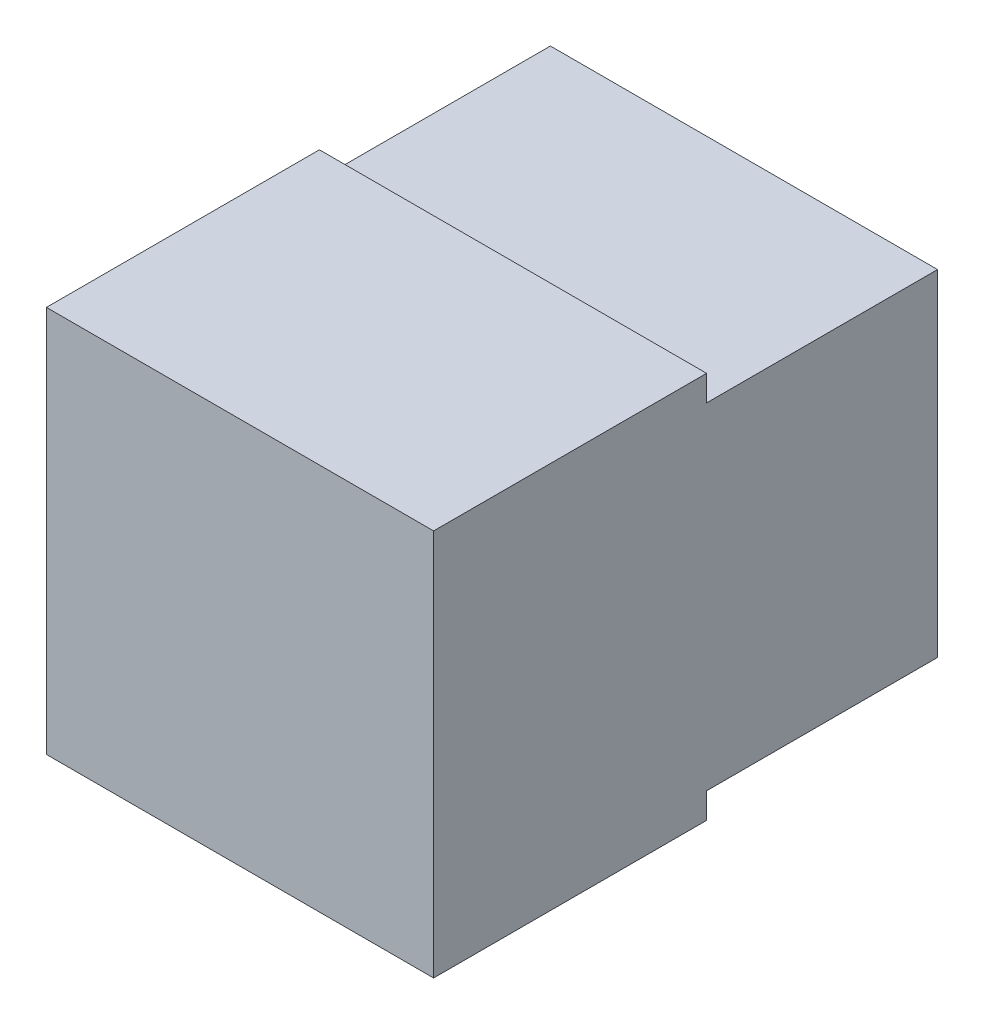
ISO-10303-21;
HEADER;
FILE_DESCRIPTION(('STEP AP214'),'2;1');
FILE_NAME('part.step','',(''),(''),'','','');
FILE_SCHEMA(('AUTOMOTIVE_DESIGN { 1 0 10303 214 1 1 1 1 }'));
ENDSEC;
DATA;
#1=APPLICATION_CONTEXT('core data for automotive mechanical design processes');
#2=APPLICATION_PROTOCOL_DEFINITION('international standard','automotive_design',2000,#1);
#3=PRODUCT_CONTEXT('',#1,'mechanical');
#4=PRODUCT('Part','Part','',(#3));
#5=PRODUCT_RELATED_PRODUCT_CATEGORY('part','',(#4));
#6=PRODUCT_DEFINITION_FORMATION('','',#4);
#7=PRODUCT_DEFINITION_CONTEXT('part definition',#1,'design');
#8=PRODUCT_DEFINITION('design','',#6,#7);
#9=PRODUCT_DEFINITION_SHAPE('','',#8);
#10=(LENGTH_UNIT() NAMED_UNIT(*) SI_UNIT(.MILLI.,.METRE.));
#11=(NAMED_UNIT(*) PLANE_ANGLE_UNIT() SI_UNIT($,.RADIAN.));
#12=(NAMED_UNIT(*) SI_UNIT($,.STERADIAN.) SOLID_ANGLE_UNIT());
#13=UNCERTAINTY_MEASURE_WITH_UNIT(LENGTH_MEASURE(1.E-05),#10,'distance_accuracy_value','');
#14=(GEOMETRIC_REPRESENTATION_CONTEXT(3) GLOBAL_UNCERTAINTY_ASSIGNED_CONTEXT((#13)) GLOBAL_UNIT_ASSIGNED_CONTEXT((#10,
#11,#12)) REPRESENTATION_CONTEXT('',''));
#15=CARTESIAN_POINT('',(0.,0.,0.));
#16=DIRECTION('',(0.,0.,1.));
#17=DIRECTION('',(1.,0.,0.));
#18=AXIS2_PLACEMENT_3D('',#15,#16,#17);
#19=CARTESIAN_POINT('',(0.,0.,-32.5));
#20=DIRECTION('',(0.,0.,-1.));
#21=DIRECTION('',(-1.,0.,0.));
#22=AXIS2_PLACEMENT_3D('',#19,#20,#21);
#23=PLANE('',#22);
#24=DIRECTION('',(1.,0.,0.));
#25=VECTOR('',#24,1.);
#26=CARTESIAN_POINT('',(-23.0488611432322,19.9988611432322,-32.5));
#27=LINE('',#26,#25);
#28=CARTESIAN_POINT('',(-23.0488611432322,19.9988611432322,-32.5));
#29=VERTEX_POINT('',#28);
#30=CARTESIAN_POINT('',(23.0488611432322,19.9988611432322,-32.5));
#31=VERTEX_POINT('',#30);
#32=EDGE_CURVE('E121',#29,#31,#27,.T.);
#33=ORIENTED_EDGE('',*,*,#32,.F.);
#34=DIRECTION('',(0.,-1.,0.));
#35=VECTOR('',#34,1.);
#36=CARTESIAN_POINT('',(-23.0488611432322,23.0488611432322,-32.5));
#37=LINE('',#36,#35);
#38=CARTESIAN_POINT('',(-23.0488611432322,23.0488611432322,-32.5));
#39=VERTEX_POINT('',#38);
#40=EDGE_CURVE('E135',#39,#29,#37,.T.);
#41=ORIENTED_EDGE('',*,*,#40,.F.);
#42=DIRECTION('',(-1.,0.,0.));
#43=VECTOR('',#42,1.);
#44=CARTESIAN_POINT('',(23.0488611432322,23.0488611432322,-32.5));
#45=LINE('',#44,#43);
#46=CARTESIAN_POINT('',(23.0488611432322,23.0488611432322,-32.5));
#47=VERTEX_POINT('',#46);
#48=EDGE_CURVE('E143',#47,#39,#45,.T.);
#49=ORIENTED_EDGE('',*,*,#48,.F.);
#50=DIRECTION('',(0.,1.,0.));
#51=VECTOR('',#50,1.);
#52=CARTESIAN_POINT('',(23.0488611432322,23.0488611432322,-32.5));
#53=LINE('',#52,#51);
#54=EDGE_CURVE('E52',#31,#47,#53,.T.);
#55=ORIENTED_EDGE('',*,*,#54,.F.);
#56=EDGE_LOOP('',(#33,#41,#49,#55));
#57=FACE_BOUND('',#56,.T.);
#58=ADVANCED_FACE('F35',(#57),#23,.T.);
#59=CARTESIAN_POINT('',(-23.0488611432322,23.0488611432322,-32.5));
#60=DIRECTION('',(-1.,0.,0.));
#61=DIRECTION('',(0.,0.,1.));
#62=AXIS2_PLACEMENT_3D('',#59,#60,#61);
#63=PLANE('',#62);
#64=DIRECTION('',(0.,-1.,0.));
#65=VECTOR('',#64,1.);
#66=CARTESIAN_POINT('',(-23.0488611432322,23.0488611432322,0.));
#67=LINE('',#66,#65);
#68=CARTESIAN_POINT('',(-23.0488611432322,23.0488611432322,0.));
#69=VERTEX_POINT('',#68);
#70=CARTESIAN_POINT('',(-23.0488611432322,-23.0488611432322,0.));
#71=VERTEX_POINT('',#70);
#72=EDGE_CURVE('E126',#69,#71,#67,.T.);
#73=ORIENTED_EDGE('',*,*,#72,.F.);
#74=DIRECTION('',(0.,0.,1.));
#75=VECTOR('',#74,1.);
#76=CARTESIAN_POINT('',(-23.0488611432322,23.0488611432322,-32.5));
#77=LINE('',#76,#75);
#78=EDGE_CURVE('E11',#39,#69,#77,.T.);
#79=ORIENTED_EDGE('',*,*,#78,.F.);
#80=ORIENTED_EDGE('',*,*,#40,.T.);
#81=DIRECTION('',(0.,0.,1.));
#82=VECTOR('',#81,1.);
#83=CARTESIAN_POINT('',(-23.0488611432322,19.9988611432322,-60.));
#84=LINE('',#83,#82);
#85=CARTESIAN_POINT('',(-23.0488611432322,19.9988611432322,-60.));
#86=VERTEX_POINT('',#85);
#87=EDGE_CURVE('E131',#86,#29,#84,.T.);
#88=ORIENTED_EDGE('',*,*,#87,.F.);
#89=DIRECTION('',(0.,1.,0.));
#90=VECTOR('',#89,1.);
#91=CARTESIAN_POINT('',(-23.0488611432322,19.9988611432322,-60.));
#92=LINE('',#91,#90);
#93=CARTESIAN_POINT('',(-23.0488611432322,-19.9988611432322,-60.));
#94=VERTEX_POINT('',#93);
#95=EDGE_CURVE('E111',#94,#86,#92,.T.);
#96=ORIENTED_EDGE('',*,*,#95,.F.);
#97=DIRECTION('',(0.,0.,1.));
#98=VECTOR('',#97,1.);
#99=CARTESIAN_POINT('',(-23.0488611432322,-19.9988611432322,-60.));
#100=LINE('',#99,#98);
#101=CARTESIAN_POINT('',(-23.0488611432322,-19.9988611432322,-32.5));
#102=VERTEX_POINT('',#101);
#103=EDGE_CURVE('E108',#94,#102,#100,.T.);
#104=ORIENTED_EDGE('',*,*,#103,.T.);
#105=CARTESIAN_POINT('',(-23.0488611432322,-23.0488611432322,-32.5));
#106=VERTEX_POINT('',#105);
#107=EDGE_CURVE('E139',#102,#106,#37,.T.);
#108=ORIENTED_EDGE('',*,*,#107,.T.);
#109=DIRECTION('',(0.,0.,1.));
#110=VECTOR('',#109,1.);
#111=CARTESIAN_POINT('',(-23.0488611432322,-23.0488611432322,-32.5));
#112=LINE('',#111,#110);
#113=EDGE_CURVE('E39',#106,#71,#112,.T.);
#114=ORIENTED_EDGE('',*,*,#113,.T.);
#115=EDGE_LOOP('',(#73,#79,#80,#88,#96,#104,#108,#114));
#116=FACE_BOUND('',#115,.T.);
#117=ADVANCED_FACE('F37',(#116),#63,.T.);
#118=CARTESIAN_POINT('',(23.0488611432322,23.0488611432322,-32.5));
#119=DIRECTION('',(0.,1.,0.));
#120=DIRECTION('',(0.,0.,1.));
#121=AXIS2_PLACEMENT_3D('',#118,#119,#120);
#122=PLANE('',#121);
#123=DIRECTION('',(-1.,0.,0.));
#124=VECTOR('',#123,1.);
#125=CARTESIAN_POINT('',(23.0488611432322,23.0488611432322,0.));
#126=LINE('',#125,#124);
#127=CARTESIAN_POINT('',(23.0488611432322,23.0488611432322,0.));
#128=VERTEX_POINT('',#127);
#129=EDGE_CURVE('E151',#128,#69,#126,.T.);
#130=ORIENTED_EDGE('',*,*,#129,.F.);
#131=DIRECTION('',(0.,0.,1.));
#132=VECTOR('',#131,1.);
#133=CARTESIAN_POINT('',(23.0488611432322,23.0488611432322,-32.5));
#134=LINE('',#133,#132);
#135=EDGE_CURVE('E44',#47,#128,#134,.T.);
#136=ORIENTED_EDGE('',*,*,#135,.F.);
#137=ORIENTED_EDGE('',*,*,#48,.T.);
#138=ORIENTED_EDGE('',*,*,#78,.T.);
#139=EDGE_LOOP('',(#130,#136,#137,#138));
#140=FACE_BOUND('',#139,.T.);
#141=ADVANCED_FACE('F167',(#140),#122,.T.);
#142=CARTESIAN_POINT('',(23.0488611432322,23.0488611432322,-32.5));
#143=DIRECTION('',(1.,0.,0.));
#144=DIRECTION('',(0.,0.,-1.));
#145=AXIS2_PLACEMENT_3D('',#142,#143,#144);
#146=PLANE('',#145);
#147=DIRECTION('',(0.,1.,0.));
#148=VECTOR('',#147,1.);
#149=CARTESIAN_POINT('',(23.0488611432322,23.0488611432322,0.));
#150=LINE('',#149,#148);
#151=CARTESIAN_POINT('',(23.0488611432322,-23.0488611432322,0.));
#152=VERTEX_POINT('',#151);
#153=EDGE_CURVE('E148',#152,#128,#150,.T.);
#154=ORIENTED_EDGE('',*,*,#153,.F.);
#155=DIRECTION('',(0.,0.,1.));
#156=VECTOR('',#155,1.);
#157=CARTESIAN_POINT('',(23.0488611432322,-23.0488611432322,-32.5));
#158=LINE('',#157,#156);
#159=CARTESIAN_POINT('',(23.0488611432322,-23.0488611432322,-32.5));
#160=VERTEX_POINT('',#159);
#161=EDGE_CURVE('E154',#160,#152,#158,.T.);
#162=ORIENTED_EDGE('',*,*,#161,.F.);
#163=CARTESIAN_POINT('',(23.0488611432322,-19.9988611432322,-32.5));
#164=VERTEX_POINT('',#163);
#165=EDGE_CURVE('E125',#160,#164,#53,.T.);
#166=ORIENTED_EDGE('',*,*,#165,.T.);
#167=DIRECTION('',(0.,0.,1.));
#168=VECTOR('',#167,1.);
#169=CARTESIAN_POINT('',(23.0488611432322,-19.9988611432322,-60.));
#170=LINE('',#169,#168);
#171=CARTESIAN_POINT('',(23.0488611432322,-19.9988611432322,-60.));
#172=VERTEX_POINT('',#171);
#173=EDGE_CURVE('E106',#172,#164,#170,.T.);
#174=ORIENTED_EDGE('',*,*,#173,.F.);
#175=DIRECTION('',(0.,-1.,0.));
#176=VECTOR('',#175,1.);
#177=CARTESIAN_POINT('',(23.0488611432322,19.9988611432322,-60.));
#178=LINE('',#177,#176);
#179=CARTESIAN_POINT('',(23.0488611432322,19.9988611432322,-60.));
#180=VERTEX_POINT('',#179);
#181=EDGE_CURVE('E112',#180,#172,#178,.T.);
#182=ORIENTED_EDGE('',*,*,#181,.F.);
#183=DIRECTION('',(0.,0.,1.));
#184=VECTOR('',#183,1.);
#185=CARTESIAN_POINT('',(23.0488611432322,19.9988611432322,-60.));
#186=LINE('',#185,#184);
#187=EDGE_CURVE('E176',#180,#31,#186,.T.);
#188=ORIENTED_EDGE('',*,*,#187,.T.);
#189=ORIENTED_EDGE('',*,*,#54,.T.);
#190=ORIENTED_EDGE('',*,*,#135,.T.);
#191=EDGE_LOOP('',(#154,#162,#166,#174,#182,#188,#189,#190));
#192=FACE_BOUND('',#191,.T.);
#193=ADVANCED_FACE('F124',(#192),#146,.T.);
#194=CARTESIAN_POINT('',(23.0488611432322,-23.0488611432322,-32.5));
#195=DIRECTION('',(0.,-1.,0.));
#196=DIRECTION('',(0.,0.,-1.));
#197=AXIS2_PLACEMENT_3D('',#194,#195,#196);
#198=PLANE('',#197);
#199=DIRECTION('',(1.,0.,0.));
#200=VECTOR('',#199,1.);
#201=CARTESIAN_POINT('',(23.0488611432322,-23.0488611432322,0.));
#202=LINE('',#201,#200);
#203=EDGE_CURVE('E129',#71,#152,#202,.T.);
#204=ORIENTED_EDGE('',*,*,#203,.F.);
#205=ORIENTED_EDGE('',*,*,#113,.F.);
#206=DIRECTION('',(1.,0.,0.));
#207=VECTOR('',#206,1.);
#208=CARTESIAN_POINT('',(23.0488611432322,-23.0488611432322,-32.5));
#209=LINE('',#208,#207);
#210=EDGE_CURVE('E138',#106,#160,#209,.T.);
#211=ORIENTED_EDGE('',*,*,#210,.T.);
#212=ORIENTED_EDGE('',*,*,#161,.T.);
#213=EDGE_LOOP('',(#204,#205,#211,#212));
#214=FACE_BOUND('',#213,.T.);
#215=ADVANCED_FACE('F161',(#214),#198,.T.);
#216=DIRECTION('',(-1.,0.,0.));
#217=VECTOR('',#216,1.);
#218=CARTESIAN_POINT('',(-23.0488611432322,-19.9988611432322,-32.5));
#219=LINE('',#218,#217);
#220=EDGE_CURVE('E60',#164,#102,#219,.T.);
#221=ORIENTED_EDGE('',*,*,#220,.F.);
#222=ORIENTED_EDGE('',*,*,#165,.F.);
#223=ORIENTED_EDGE('',*,*,#210,.F.);
#224=ORIENTED_EDGE('',*,*,#107,.F.);
#225=EDGE_LOOP('',(#221,#222,#223,#224));
#226=FACE_BOUND('',#225,.T.);
#227=ADVANCED_FACE('F179',(#226),#23,.T.);
#228=CARTESIAN_POINT('',(0.,0.,0.));
#229=DIRECTION('',(0.,0.,-1.));
#230=DIRECTION('',(-1.,0.,0.));
#231=AXIS2_PLACEMENT_3D('',#228,#229,#230);
#232=PLANE('',#231);
#233=ORIENTED_EDGE('',*,*,#72,.T.);
#234=ORIENTED_EDGE('',*,*,#203,.T.);
#235=ORIENTED_EDGE('',*,*,#153,.T.);
#236=ORIENTED_EDGE('',*,*,#129,.T.);
#237=EDGE_LOOP('',(#233,#234,#235,#236));
#238=FACE_BOUND('',#237,.T.);
#239=ADVANCED_FACE('F163',(#238),#232,.F.);
#240=CARTESIAN_POINT('',(-23.0488611432322,-19.9988611432322,-60.));
#241=DIRECTION('',(0.,1.,0.));
#242=DIRECTION('',(0.,0.,1.));
#243=AXIS2_PLACEMENT_3D('',#240,#241,#242);
#244=PLANE('',#243);
#245=ORIENTED_EDGE('',*,*,#220,.T.);
#246=ORIENTED_EDGE('',*,*,#103,.F.);
#247=DIRECTION('',(-1.,0.,0.));
#248=VECTOR('',#247,1.);
#249=CARTESIAN_POINT('',(-23.0488611432322,-19.9988611432322,-60.));
#250=LINE('',#249,#248);
#251=EDGE_CURVE('E102',#172,#94,#250,.T.);
#252=ORIENTED_EDGE('',*,*,#251,.F.);
#253=ORIENTED_EDGE('',*,*,#173,.T.);
#254=EDGE_LOOP('',(#245,#246,#252,#253));
#255=FACE_BOUND('',#254,.T.);
#256=ADVANCED_FACE('F104',(#255),#244,.F.);
#257=CARTESIAN_POINT('',(-23.0488611432322,19.9988611432322,-60.));
#258=DIRECTION('',(0.,-1.,0.));
#259=DIRECTION('',(0.,0.,-1.));
#260=AXIS2_PLACEMENT_3D('',#257,#258,#259);
#261=PLANE('',#260);
#262=ORIENTED_EDGE('',*,*,#32,.T.);
#263=ORIENTED_EDGE('',*,*,#187,.F.);
#264=DIRECTION('',(1.,0.,0.));
#265=VECTOR('',#264,1.);
#266=CARTESIAN_POINT('',(-23.0488611432322,19.9988611432322,-60.));
#267=LINE('',#266,#265);
#268=EDGE_CURVE('E117',#86,#180,#267,.T.);
#269=ORIENTED_EDGE('',*,*,#268,.F.);
#270=ORIENTED_EDGE('',*,*,#87,.T.);
#271=EDGE_LOOP('',(#262,#263,#269,#270));
#272=FACE_BOUND('',#271,.T.);
#273=ADVANCED_FACE('F177',(#272),#261,.F.);
#274=CARTESIAN_POINT('',(0.,0.,-60.));
#275=DIRECTION('',(0.,0.,1.));
#276=DIRECTION('',(1.,0.,0.));
#277=AXIS2_PLACEMENT_3D('',#274,#275,#276);
#278=PLANE('',#277);
#279=ORIENTED_EDGE('',*,*,#181,.T.);
#280=ORIENTED_EDGE('',*,*,#251,.T.);
#281=ORIENTED_EDGE('',*,*,#95,.T.);
#282=ORIENTED_EDGE('',*,*,#268,.T.);
#283=EDGE_LOOP('',(#279,#280,#281,#282));
#284=FACE_BOUND('',#283,.T.);
#285=ADVANCED_FACE('F115',(#284),#278,.F.);
#286=CLOSED_SHELL('',(#58,#117,#141,#193,#215,#227,#239,#256,#273,#285));
#287=MANIFOLD_SOLID_BREP('B2',#286);
#288=ADVANCED_BREP_SHAPE_REPRESENTATION('',(#18,#287),#14);
#289=SHAPE_DEFINITION_REPRESENTATION(#9,#288);
ENDSEC;
END-ISO-10303-21;
